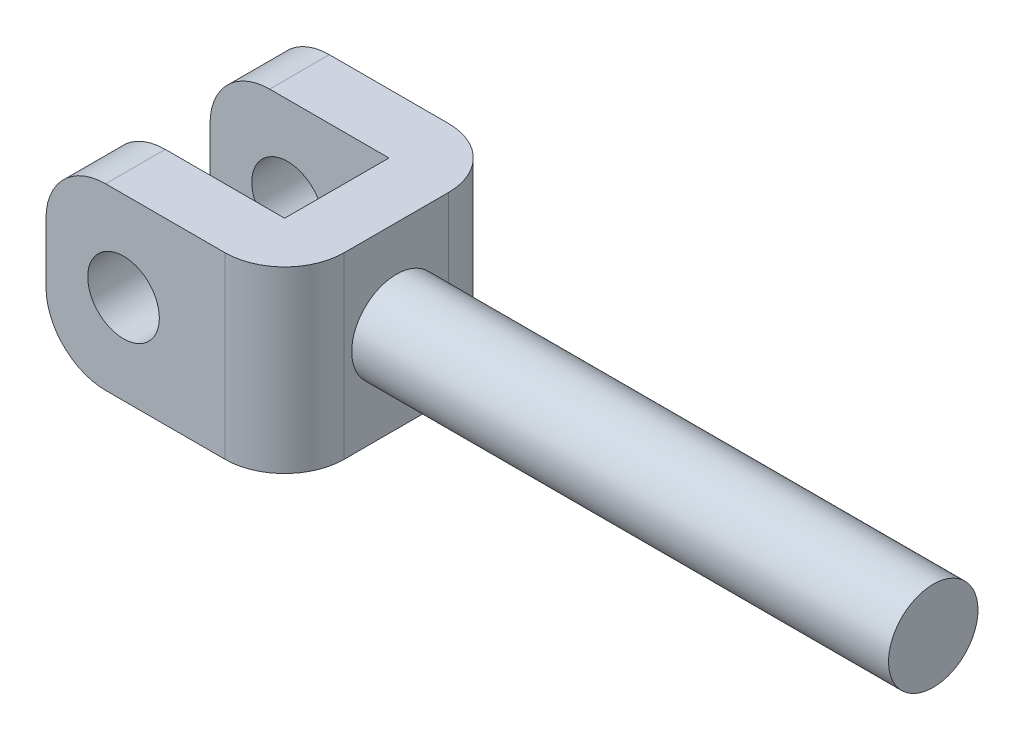
ISO-10303-21;
HEADER;
FILE_DESCRIPTION(('STEP AP214'),'2;1');
FILE_NAME('part.step','',(''),(''),'','','');
FILE_SCHEMA(('AUTOMOTIVE_DESIGN { 1 0 10303 214 1 1 1 1 }'));
ENDSEC;
DATA;
#1=APPLICATION_CONTEXT('core data for automotive mechanical design processes');
#2=APPLICATION_PROTOCOL_DEFINITION('international standard','automotive_design',2000,#1);
#3=PRODUCT_CONTEXT('',#1,'mechanical');
#4=PRODUCT('Part','Part','',(#3));
#5=PRODUCT_RELATED_PRODUCT_CATEGORY('part','',(#4));
#6=PRODUCT_DEFINITION_FORMATION('','',#4);
#7=PRODUCT_DEFINITION_CONTEXT('part definition',#1,'design');
#8=PRODUCT_DEFINITION('design','',#6,#7);
#9=PRODUCT_DEFINITION_SHAPE('','',#8);
#10=(LENGTH_UNIT() NAMED_UNIT(*) SI_UNIT(.MILLI.,.METRE.));
#11=(NAMED_UNIT(*) PLANE_ANGLE_UNIT() SI_UNIT($,.RADIAN.));
#12=(NAMED_UNIT(*) SI_UNIT($,.STERADIAN.) SOLID_ANGLE_UNIT());
#13=UNCERTAINTY_MEASURE_WITH_UNIT(LENGTH_MEASURE(1.E-05),#10,'distance_accuracy_value','');
#14=(GEOMETRIC_REPRESENTATION_CONTEXT(3) GLOBAL_UNCERTAINTY_ASSIGNED_CONTEXT((#13)) GLOBAL_UNIT_ASSIGNED_CONTEXT((#10,
#11,#12)) REPRESENTATION_CONTEXT('',''));
#15=CARTESIAN_POINT('',(0.,0.,0.));
#16=DIRECTION('',(0.,0.,1.));
#17=DIRECTION('',(1.,0.,0.));
#18=AXIS2_PLACEMENT_3D('',#15,#16,#17);
#19=CARTESIAN_POINT('',(10.,0.,0.));
#20=DIRECTION('',(-1.,0.,0.));
#21=DIRECTION('',(0.,0.,1.));
#22=AXIS2_PLACEMENT_3D('',#19,#20,#21);
#23=CYLINDRICAL_SURFACE('',#22,0.75);
#24=CARTESIAN_POINT('',(0.999999999999999,0.,0.));
#25=DIRECTION('',(1.,0.,0.));
#26=DIRECTION('',(0.,0.,-1.));
#27=AXIS2_PLACEMENT_3D('',#24,#25,#26);
#28=CIRCLE('',#27,0.75);
#29=CARTESIAN_POINT('',(0.999999999999999,0.,-0.75));
#30=VERTEX_POINT('',#29);
#31=EDGE_CURVE('E217',#30,#30,#28,.T.);
#32=ORIENTED_EDGE('',*,*,#31,.T.);
#33=EDGE_LOOP('',(#32));
#34=FACE_BOUND('',#33,.T.);
#35=CARTESIAN_POINT('',(10.,0.,0.));
#36=DIRECTION('',(1.,0.,0.));
#37=DIRECTION('',(0.,0.,-1.));
#38=AXIS2_PLACEMENT_3D('',#35,#36,#37);
#39=CIRCLE('',#38,0.75);
#40=CARTESIAN_POINT('',(10.,0.,-0.75));
#41=VERTEX_POINT('',#40);
#42=EDGE_CURVE('E230',#41,#41,#39,.T.);
#43=ORIENTED_EDGE('',*,*,#42,.F.);
#44=EDGE_LOOP('',(#43));
#45=FACE_BOUND('',#44,.T.);
#46=ADVANCED_FACE('F43',(#34,#45),#23,.T.);
#47=CARTESIAN_POINT('',(10.,0.,0.));
#48=DIRECTION('',(1.,0.,0.));
#49=DIRECTION('',(0.,0.,-1.));
#50=AXIS2_PLACEMENT_3D('',#47,#48,#49);
#51=PLANE('',#50);
#52=ORIENTED_EDGE('',*,*,#42,.T.);
#53=EDGE_LOOP('',(#52));
#54=FACE_BOUND('',#53,.T.);
#55=ADVANCED_FACE('F346',(#54),#51,.T.);
#56=CARTESIAN_POINT('',(0.,-1.5,-0.875));
#57=DIRECTION('',(0.,0.,1.));
#58=DIRECTION('',(1.,0.,0.));
#59=AXIS2_PLACEMENT_3D('',#56,#57,#58);
#60=PLANE('',#59);
#61=CARTESIAN_POINT('',(-1.7,0.,-0.875));
#62=DIRECTION('',(0.,0.,1.));
#63=DIRECTION('',(1.,0.,0.));
#64=AXIS2_PLACEMENT_3D('',#61,#62,#63);
#65=CIRCLE('',#64,0.6);
#66=CARTESIAN_POINT('',(-1.1,0.,-0.875));
#67=VERTEX_POINT('',#66);
#68=EDGE_CURVE('E161',#67,#67,#65,.T.);
#69=ORIENTED_EDGE('',*,*,#68,.F.);
#70=EDGE_LOOP('',(#69));
#71=FACE_BOUND('',#70,.T.);
#72=DIRECTION('',(1.,0.,0.));
#73=VECTOR('',#72,1.);
#74=CARTESIAN_POINT('',(0.,1.5,-0.875));
#75=LINE('',#74,#73);
#76=CARTESIAN_POINT('',(-2.,1.5,-0.875));
#77=VERTEX_POINT('',#76);
#78=CARTESIAN_POINT('',(0.,1.5,-0.875));
#79=VERTEX_POINT('',#78);
#80=EDGE_CURVE('E149',#77,#79,#75,.T.);
#81=ORIENTED_EDGE('',*,*,#80,.F.);
#82=CARTESIAN_POINT('',(-2.,0.5,-0.875));
#83=DIRECTION('',(0.,0.,1.));
#84=DIRECTION('',(1.,0.,0.));
#85=AXIS2_PLACEMENT_3D('',#82,#83,#84);
#86=CIRCLE('',#85,1.);
#87=CARTESIAN_POINT('',(-3.,0.5,-0.875));
#88=VERTEX_POINT('',#87);
#89=EDGE_CURVE('E252',#77,#88,#86,.T.);
#90=ORIENTED_EDGE('',*,*,#89,.T.);
#91=DIRECTION('',(0.,1.,0.));
#92=VECTOR('',#91,1.);
#93=CARTESIAN_POINT('',(-3.,-1.5,-0.875));
#94=LINE('',#93,#92);
#95=CARTESIAN_POINT('',(-3.,-0.5,-0.875));
#96=VERTEX_POINT('',#95);
#97=EDGE_CURVE('E213',#96,#88,#94,.T.);
#98=ORIENTED_EDGE('',*,*,#97,.F.);
#99=CARTESIAN_POINT('',(-2.,-0.5,-0.875));
#100=DIRECTION('',(0.,0.,1.));
#101=DIRECTION('',(1.,0.,0.));
#102=AXIS2_PLACEMENT_3D('',#99,#100,#101);
#103=CIRCLE('',#102,1.);
#104=CARTESIAN_POINT('',(-2.,-1.5,-0.875));
#105=VERTEX_POINT('',#104);
#106=EDGE_CURVE('E249',#96,#105,#103,.T.);
#107=ORIENTED_EDGE('',*,*,#106,.T.);
#108=DIRECTION('',(1.,0.,0.));
#109=VECTOR('',#108,1.);
#110=CARTESIAN_POINT('',(0.,-1.5,-0.875));
#111=LINE('',#110,#109);
#112=CARTESIAN_POINT('',(0.,-1.5,-0.875));
#113=VERTEX_POINT('',#112);
#114=EDGE_CURVE('E167',#105,#113,#111,.T.);
#115=ORIENTED_EDGE('',*,*,#114,.T.);
#116=DIRECTION('',(0.,1.,0.));
#117=VECTOR('',#116,1.);
#118=CARTESIAN_POINT('',(0.,-1.5,-0.875));
#119=LINE('',#118,#117);
#120=EDGE_CURVE('E164',#113,#79,#119,.T.);
#121=ORIENTED_EDGE('',*,*,#120,.T.);
#122=EDGE_LOOP('',(#81,#90,#98,#107,#115,#121));
#123=FACE_BOUND('',#122,.T.);
#124=ADVANCED_FACE('F165',(#71,#123),#60,.T.);
#125=CARTESIAN_POINT('',(-3.,-1.5,-1.875));
#126=DIRECTION('',(-1.,0.,0.));
#127=DIRECTION('',(0.,0.,1.));
#128=AXIS2_PLACEMENT_3D('',#125,#126,#127);
#129=PLANE('',#128);
#130=ORIENTED_EDGE('',*,*,#97,.T.);
#131=DIRECTION('',(0.,0.,1.));
#132=VECTOR('',#131,1.);
#133=CARTESIAN_POINT('',(-3.,0.5,-1.875));
#134=LINE('',#133,#132);
#135=CARTESIAN_POINT('',(-3.,0.5,-1.875));
#136=VERTEX_POINT('',#135);
#137=EDGE_CURVE('E259',#88,#136,#134,.F.);
#138=ORIENTED_EDGE('',*,*,#137,.T.);
#139=DIRECTION('',(0.,1.,0.));
#140=VECTOR('',#139,1.);
#141=CARTESIAN_POINT('',(-3.,-1.5,-1.875));
#142=LINE('',#141,#140);
#143=CARTESIAN_POINT('',(-3.,-0.5,-1.875));
#144=VERTEX_POINT('',#143);
#145=EDGE_CURVE('E218',#144,#136,#142,.T.);
#146=ORIENTED_EDGE('',*,*,#145,.F.);
#147=DIRECTION('',(0.,0.,1.));
#148=VECTOR('',#147,1.);
#149=CARTESIAN_POINT('',(-3.,-0.5,-0.875));
#150=LINE('',#149,#148);
#151=EDGE_CURVE('E255',#144,#96,#150,.T.);
#152=ORIENTED_EDGE('',*,*,#151,.T.);
#153=EDGE_LOOP('',(#130,#138,#146,#152));
#154=FACE_BOUND('',#153,.T.);
#155=ADVANCED_FACE('F384',(#154),#129,.T.);
#156=CARTESIAN_POINT('',(1.,-1.5,-1.875));
#157=DIRECTION('',(0.,0.,-1.));
#158=DIRECTION('',(-1.,0.,0.));
#159=AXIS2_PLACEMENT_3D('',#156,#157,#158);
#160=PLANE('',#159);
#161=CARTESIAN_POINT('',(-1.7,0.,-1.875));
#162=DIRECTION('',(0.,0.,-1.));
#163=DIRECTION('',(-1.,0.,0.));
#164=AXIS2_PLACEMENT_3D('',#161,#162,#163);
#165=CIRCLE('',#164,0.6);
#166=CARTESIAN_POINT('',(-2.3,0.,-1.875));
#167=VERTEX_POINT('',#166);
#168=EDGE_CURVE('E416',#167,#167,#165,.T.);
#169=ORIENTED_EDGE('',*,*,#168,.F.);
#170=EDGE_LOOP('',(#169));
#171=FACE_BOUND('',#170,.T.);
#172=ORIENTED_EDGE('',*,*,#145,.T.);
#173=CARTESIAN_POINT('',(-2.,0.5,-1.875));
#174=DIRECTION('',(0.,0.,-1.));
#175=DIRECTION('',(-1.,0.,0.));
#176=AXIS2_PLACEMENT_3D('',#173,#174,#175);
#177=CIRCLE('',#176,1.);
#178=CARTESIAN_POINT('',(-2.,1.5,-1.875));
#179=VERTEX_POINT('',#178);
#180=EDGE_CURVE('E268',#136,#179,#177,.T.);
#181=ORIENTED_EDGE('',*,*,#180,.T.);
#182=DIRECTION('',(-1.,0.,0.));
#183=VECTOR('',#182,1.);
#184=CARTESIAN_POINT('',(1.,1.5,-1.875));
#185=LINE('',#184,#183);
#186=CARTESIAN_POINT('',(0.,1.5,-1.875));
#187=VERTEX_POINT('',#186);
#188=EDGE_CURVE('E191',#187,#179,#185,.T.);
#189=ORIENTED_EDGE('',*,*,#188,.F.);
#190=DIRECTION('',(0.,1.,0.));
#191=VECTOR('',#190,1.);
#192=CARTESIAN_POINT('',(0.,-1.5,-1.875));
#193=LINE('',#192,#191);
#194=CARTESIAN_POINT('',(0.,-1.5,-1.875));
#195=VERTEX_POINT('',#194);
#196=EDGE_CURVE('E262',#187,#195,#193,.F.);
#197=ORIENTED_EDGE('',*,*,#196,.T.);
#198=DIRECTION('',(-1.,0.,0.));
#199=VECTOR('',#198,1.);
#200=CARTESIAN_POINT('',(1.,-1.5,-1.875));
#201=LINE('',#200,#199);
#202=CARTESIAN_POINT('',(-2.,-1.5,-1.875));
#203=VERTEX_POINT('',#202);
#204=EDGE_CURVE('E173',#195,#203,#201,.T.);
#205=ORIENTED_EDGE('',*,*,#204,.T.);
#206=CARTESIAN_POINT('',(-2.,-0.5,-1.875));
#207=DIRECTION('',(0.,0.,-1.));
#208=DIRECTION('',(-1.,0.,0.));
#209=AXIS2_PLACEMENT_3D('',#206,#207,#208);
#210=CIRCLE('',#209,1.);
#211=EDGE_CURVE('E265',#203,#144,#210,.T.);
#212=ORIENTED_EDGE('',*,*,#211,.T.);
#213=EDGE_LOOP('',(#172,#181,#189,#197,#205,#212));
#214=FACE_BOUND('',#213,.T.);
#215=ADVANCED_FACE('F378',(#171,#214),#160,.T.);
#216=CARTESIAN_POINT('',(1.,-1.5,-1.875));
#217=DIRECTION('',(1.,0.,0.));
#218=DIRECTION('',(0.,0.,-1.));
#219=AXIS2_PLACEMENT_3D('',#216,#217,#218);
#220=PLANE('',#219);
#221=ORIENTED_EDGE('',*,*,#31,.F.);
#222=EDGE_LOOP('',(#221));
#223=FACE_BOUND('',#222,.T.);
#224=DIRECTION('',(0.,0.,-1.));
#225=VECTOR('',#224,1.);
#226=CARTESIAN_POINT('',(1.,-1.5,-1.875));
#227=LINE('',#226,#225);
#228=CARTESIAN_POINT('',(1.,-1.5,0.874999999999999));
#229=VERTEX_POINT('',#228);
#230=CARTESIAN_POINT('',(1.,-1.5,-0.875000000000001));
#231=VERTEX_POINT('',#230);
#232=EDGE_CURVE('E206',#229,#231,#227,.T.);
#233=ORIENTED_EDGE('',*,*,#232,.T.);
#234=DIRECTION('',(0.,1.,0.));
#235=VECTOR('',#234,1.);
#236=CARTESIAN_POINT('',(1.,-1.5,-0.875));
#237=LINE('',#236,#235);
#238=CARTESIAN_POINT('',(1.,1.5,-0.875000000000001));
#239=VERTEX_POINT('',#238);
#240=EDGE_CURVE('E11',#231,#239,#237,.T.);
#241=ORIENTED_EDGE('',*,*,#240,.T.);
#242=DIRECTION('',(0.,0.,-1.));
#243=VECTOR('',#242,1.);
#244=CARTESIAN_POINT('',(1.,1.5,-1.875));
#245=LINE('',#244,#243);
#246=CARTESIAN_POINT('',(1.,1.5,0.874999999999999));
#247=VERTEX_POINT('',#246);
#248=EDGE_CURVE('E187',#247,#239,#245,.T.);
#249=ORIENTED_EDGE('',*,*,#248,.F.);
#250=DIRECTION('',(0.,1.,0.));
#251=VECTOR('',#250,1.);
#252=CARTESIAN_POINT('',(1.,-1.5,0.875));
#253=LINE('',#252,#251);
#254=EDGE_CURVE('E53',#247,#229,#253,.F.);
#255=ORIENTED_EDGE('',*,*,#254,.T.);
#256=EDGE_LOOP('',(#233,#241,#249,#255));
#257=FACE_BOUND('',#256,.T.);
#258=ADVANCED_FACE('F309',(#223,#257),#220,.T.);
#259=CARTESIAN_POINT('',(1.,-1.5,1.875));
#260=DIRECTION('',(0.,0.,1.));
#261=DIRECTION('',(1.,0.,0.));
#262=AXIS2_PLACEMENT_3D('',#259,#260,#261);
#263=PLANE('',#262);
#264=CARTESIAN_POINT('',(-1.7,0.,1.875));
#265=DIRECTION('',(0.,0.,1.));
#266=DIRECTION('',(1.,0.,0.));
#267=AXIS2_PLACEMENT_3D('',#264,#265,#266);
#268=CIRCLE('',#267,0.6);
#269=CARTESIAN_POINT('',(-1.1,0.,1.875));
#270=VERTEX_POINT('',#269);
#271=EDGE_CURVE('E408',#270,#270,#268,.T.);
#272=ORIENTED_EDGE('',*,*,#271,.F.);
#273=EDGE_LOOP('',(#272));
#274=FACE_BOUND('',#273,.T.);
#275=DIRECTION('',(0.,1.,0.));
#276=VECTOR('',#275,1.);
#277=CARTESIAN_POINT('',(-3.,-1.5,1.875));
#278=LINE('',#277,#276);
#279=CARTESIAN_POINT('',(-3.,-0.5,1.875));
#280=VERTEX_POINT('',#279);
#281=CARTESIAN_POINT('',(-3.,0.5,1.875));
#282=VERTEX_POINT('',#281);
#283=EDGE_CURVE('E222',#280,#282,#278,.T.);
#284=ORIENTED_EDGE('',*,*,#283,.F.);
#285=CARTESIAN_POINT('',(-2.,-0.5,1.875));
#286=DIRECTION('',(0.,0.,1.));
#287=DIRECTION('',(1.,0.,0.));
#288=AXIS2_PLACEMENT_3D('',#285,#286,#287);
#289=CIRCLE('',#288,1.);
#290=CARTESIAN_POINT('',(-2.,-1.5,1.875));
#291=VERTEX_POINT('',#290);
#292=EDGE_CURVE('E296',#280,#291,#289,.T.);
#293=ORIENTED_EDGE('',*,*,#292,.T.);
#294=DIRECTION('',(1.,0.,0.));
#295=VECTOR('',#294,1.);
#296=CARTESIAN_POINT('',(1.,-1.5,1.875));
#297=LINE('',#296,#295);
#298=CARTESIAN_POINT('',(0.,-1.5,1.875));
#299=VERTEX_POINT('',#298);
#300=EDGE_CURVE('E202',#291,#299,#297,.T.);
#301=ORIENTED_EDGE('',*,*,#300,.T.);
#302=DIRECTION('',(0.,1.,0.));
#303=VECTOR('',#302,1.);
#304=CARTESIAN_POINT('',(0.,-1.5,1.875));
#305=LINE('',#304,#303);
#306=CARTESIAN_POINT('',(0.,1.5,1.875));
#307=VERTEX_POINT('',#306);
#308=EDGE_CURVE('E289',#299,#307,#305,.T.);
#309=ORIENTED_EDGE('',*,*,#308,.T.);
#310=DIRECTION('',(1.,0.,0.));
#311=VECTOR('',#310,1.);
#312=CARTESIAN_POINT('',(1.,1.5,1.875));
#313=LINE('',#312,#311);
#314=CARTESIAN_POINT('',(-2.,1.5,1.875));
#315=VERTEX_POINT('',#314);
#316=EDGE_CURVE('E180',#315,#307,#313,.T.);
#317=ORIENTED_EDGE('',*,*,#316,.F.);
#318=CARTESIAN_POINT('',(-2.,0.5,1.875));
#319=DIRECTION('',(0.,0.,1.));
#320=DIRECTION('',(1.,0.,0.));
#321=AXIS2_PLACEMENT_3D('',#318,#319,#320);
#322=CIRCLE('',#321,1.);
#323=EDGE_CURVE('E293',#315,#282,#322,.T.);
#324=ORIENTED_EDGE('',*,*,#323,.T.);
#325=EDGE_LOOP('',(#284,#293,#301,#309,#317,#324));
#326=FACE_BOUND('',#325,.T.);
#327=ADVANCED_FACE('F322',(#274,#326),#263,.T.);
#328=CARTESIAN_POINT('',(-3.,-1.5,0.875));
#329=DIRECTION('',(-1.,0.,0.));
#330=DIRECTION('',(0.,0.,1.));
#331=AXIS2_PLACEMENT_3D('',#328,#329,#330);
#332=PLANE('',#331);
#333=DIRECTION('',(0.,1.,0.));
#334=VECTOR('',#333,1.);
#335=CARTESIAN_POINT('',(-3.,-1.5,0.875));
#336=LINE('',#335,#334);
#337=CARTESIAN_POINT('',(-3.,-0.5,0.875));
#338=VERTEX_POINT('',#337);
#339=CARTESIAN_POINT('',(-3.,0.5,0.875));
#340=VERTEX_POINT('',#339);
#341=EDGE_CURVE('E225',#338,#340,#336,.T.);
#342=ORIENTED_EDGE('',*,*,#341,.F.);
#343=DIRECTION('',(0.,0.,1.));
#344=VECTOR('',#343,1.);
#345=CARTESIAN_POINT('',(-3.,-0.5,1.875));
#346=LINE('',#345,#344);
#347=EDGE_CURVE('E285',#338,#280,#346,.T.);
#348=ORIENTED_EDGE('',*,*,#347,.T.);
#349=ORIENTED_EDGE('',*,*,#283,.T.);
#350=DIRECTION('',(0.,0.,1.));
#351=VECTOR('',#350,1.);
#352=CARTESIAN_POINT('',(-3.,0.5,0.875));
#353=LINE('',#352,#351);
#354=EDGE_CURVE('E60',#282,#340,#353,.F.);
#355=ORIENTED_EDGE('',*,*,#354,.T.);
#356=EDGE_LOOP('',(#342,#348,#349,#355));
#357=FACE_BOUND('',#356,.T.);
#358=ADVANCED_FACE('F327',(#357),#332,.T.);
#359=CARTESIAN_POINT('',(-3.,-1.5,0.875));
#360=DIRECTION('',(0.,0.,-1.));
#361=DIRECTION('',(-1.,0.,0.));
#362=AXIS2_PLACEMENT_3D('',#359,#360,#361);
#363=PLANE('',#362);
#364=CARTESIAN_POINT('',(-1.7,0.,0.875));
#365=DIRECTION('',(0.,0.,-1.));
#366=DIRECTION('',(-1.,0.,0.));
#367=AXIS2_PLACEMENT_3D('',#364,#365,#366);
#368=CIRCLE('',#367,0.6);
#369=CARTESIAN_POINT('',(-2.3,0.,0.875));
#370=VERTEX_POINT('',#369);
#371=EDGE_CURVE('E47',#370,#370,#368,.T.);
#372=ORIENTED_EDGE('',*,*,#371,.F.);
#373=EDGE_LOOP('',(#372));
#374=FACE_BOUND('',#373,.T.);
#375=DIRECTION('',(-1.,0.,0.));
#376=VECTOR('',#375,1.);
#377=CARTESIAN_POINT('',(-3.,-1.5,0.875));
#378=LINE('',#377,#376);
#379=CARTESIAN_POINT('',(0.,-1.5,0.875));
#380=VERTEX_POINT('',#379);
#381=CARTESIAN_POINT('',(-2.,-1.5,0.875));
#382=VERTEX_POINT('',#381);
#383=EDGE_CURVE('E199',#380,#382,#378,.T.);
#384=ORIENTED_EDGE('',*,*,#383,.T.);
#385=CARTESIAN_POINT('',(-2.,-0.5,0.875));
#386=DIRECTION('',(0.,0.,-1.));
#387=DIRECTION('',(-1.,0.,0.));
#388=AXIS2_PLACEMENT_3D('',#385,#386,#387);
#389=CIRCLE('',#388,1.);
#390=EDGE_CURVE('E67',#382,#338,#389,.T.);
#391=ORIENTED_EDGE('',*,*,#390,.T.);
#392=ORIENTED_EDGE('',*,*,#341,.T.);
#393=CARTESIAN_POINT('',(-2.,0.5,0.875));
#394=DIRECTION('',(0.,0.,-1.));
#395=DIRECTION('',(-1.,0.,0.));
#396=AXIS2_PLACEMENT_3D('',#393,#394,#395);
#397=CIRCLE('',#396,1.);
#398=CARTESIAN_POINT('',(-2.,1.5,0.875));
#399=VERTEX_POINT('',#398);
#400=EDGE_CURVE('E299',#340,#399,#397,.T.);
#401=ORIENTED_EDGE('',*,*,#400,.T.);
#402=DIRECTION('',(-1.,0.,0.));
#403=VECTOR('',#402,1.);
#404=CARTESIAN_POINT('',(-3.,1.5,0.875));
#405=LINE('',#404,#403);
#406=CARTESIAN_POINT('',(0.,1.5,0.875));
#407=VERTEX_POINT('',#406);
#408=EDGE_CURVE('E177',#407,#399,#405,.T.);
#409=ORIENTED_EDGE('',*,*,#408,.F.);
#410=DIRECTION('',(0.,1.,0.));
#411=VECTOR('',#410,1.);
#412=CARTESIAN_POINT('',(0.,-1.5,0.875));
#413=LINE('',#412,#411);
#414=EDGE_CURVE('E172',#380,#407,#413,.T.);
#415=ORIENTED_EDGE('',*,*,#414,.F.);
#416=EDGE_LOOP('',(#384,#391,#392,#401,#409,#415));
#417=FACE_BOUND('',#416,.T.);
#418=ADVANCED_FACE('F333',(#374,#417),#363,.T.);
#419=CARTESIAN_POINT('',(0.,-1.5,0.));
#420=DIRECTION('',(0.,1.,0.));
#421=DIRECTION('',(0.,0.,1.));
#422=AXIS2_PLACEMENT_3D('',#419,#420,#421);
#423=PLANE('',#422);
#424=ORIENTED_EDGE('',*,*,#114,.F.);
#425=DIRECTION('',(0.,0.,1.));
#426=VECTOR('',#425,1.);
#427=CARTESIAN_POINT('',(-2.,-1.5,-1.875));
#428=LINE('',#427,#426);
#429=EDGE_CURVE('E280',#105,#203,#428,.F.);
#430=ORIENTED_EDGE('',*,*,#429,.T.);
#431=ORIENTED_EDGE('',*,*,#204,.F.);
#432=CARTESIAN_POINT('',(0.,-1.5,-0.875));
#433=DIRECTION('',(0.,1.,0.));
#434=DIRECTION('',(0.,0.,1.));
#435=AXIS2_PLACEMENT_3D('',#432,#433,#434);
#436=CIRCLE('',#435,1.);
#437=EDGE_CURVE('E274',#195,#231,#436,.F.);
#438=ORIENTED_EDGE('',*,*,#437,.T.);
#439=ORIENTED_EDGE('',*,*,#232,.F.);
#440=CARTESIAN_POINT('',(0.,-1.5,0.875));
#441=DIRECTION('',(0.,1.,0.));
#442=DIRECTION('',(0.,0.,1.));
#443=AXIS2_PLACEMENT_3D('',#440,#441,#442);
#444=CIRCLE('',#443,1.);
#445=EDGE_CURVE('E271',#229,#299,#444,.F.);
#446=ORIENTED_EDGE('',*,*,#445,.T.);
#447=ORIENTED_EDGE('',*,*,#300,.F.);
#448=DIRECTION('',(0.,0.,1.));
#449=VECTOR('',#448,1.);
#450=CARTESIAN_POINT('',(-2.,-1.5,0.875));
#451=LINE('',#450,#449);
#452=EDGE_CURVE('E277',#291,#382,#451,.F.);
#453=ORIENTED_EDGE('',*,*,#452,.T.);
#454=ORIENTED_EDGE('',*,*,#383,.F.);
#455=DIRECTION('',(0.,0.,1.));
#456=VECTOR('',#455,1.);
#457=CARTESIAN_POINT('',(0.,-1.5,-0.875));
#458=LINE('',#457,#456);
#459=EDGE_CURVE('E196',#113,#380,#458,.T.);
#460=ORIENTED_EDGE('',*,*,#459,.F.);
#461=EDGE_LOOP('',(#424,#430,#431,#438,#439,#446,#447,#453,#454,#460));
#462=FACE_BOUND('',#461,.T.);
#463=ADVANCED_FACE('F314',(#462),#423,.F.);
#464=CARTESIAN_POINT('',(0.,1.5,0.));
#465=DIRECTION('',(0.,1.,0.));
#466=DIRECTION('',(0.,0.,1.));
#467=AXIS2_PLACEMENT_3D('',#464,#465,#466);
#468=PLANE('',#467);
#469=ORIENTED_EDGE('',*,*,#188,.T.);
#470=DIRECTION('',(0.,0.,1.));
#471=VECTOR('',#470,1.);
#472=CARTESIAN_POINT('',(-2.,1.5,0.));
#473=LINE('',#472,#471);
#474=EDGE_CURVE('E158',#179,#77,#473,.T.);
#475=ORIENTED_EDGE('',*,*,#474,.T.);
#476=ORIENTED_EDGE('',*,*,#80,.T.);
#477=DIRECTION('',(0.,0.,1.));
#478=VECTOR('',#477,1.);
#479=CARTESIAN_POINT('',(0.,1.5,-0.875));
#480=LINE('',#479,#478);
#481=EDGE_CURVE('E155',#79,#407,#480,.T.);
#482=ORIENTED_EDGE('',*,*,#481,.T.);
#483=ORIENTED_EDGE('',*,*,#408,.T.);
#484=DIRECTION('',(0.,0.,1.));
#485=VECTOR('',#484,1.);
#486=CARTESIAN_POINT('',(-2.,1.5,0.));
#487=LINE('',#486,#485);
#488=EDGE_CURVE('E243',#399,#315,#487,.T.);
#489=ORIENTED_EDGE('',*,*,#488,.T.);
#490=ORIENTED_EDGE('',*,*,#316,.T.);
#491=CARTESIAN_POINT('',(0.,1.5,0.875));
#492=DIRECTION('',(0.,1.,0.));
#493=DIRECTION('',(0.,0.,1.));
#494=AXIS2_PLACEMENT_3D('',#491,#492,#493);
#495=CIRCLE('',#494,1.);
#496=EDGE_CURVE('E234',#307,#247,#495,.T.);
#497=ORIENTED_EDGE('',*,*,#496,.T.);
#498=ORIENTED_EDGE('',*,*,#248,.T.);
#499=CARTESIAN_POINT('',(0.,1.5,-0.875));
#500=DIRECTION('',(0.,1.,0.));
#501=DIRECTION('',(0.,0.,1.));
#502=AXIS2_PLACEMENT_3D('',#499,#500,#501);
#503=CIRCLE('',#502,1.);
#504=EDGE_CURVE('E240',#239,#187,#503,.T.);
#505=ORIENTED_EDGE('',*,*,#504,.T.);
#506=EDGE_LOOP('',(#469,#475,#476,#482,#483,#489,#490,#497,#498,#505));
#507=FACE_BOUND('',#506,.T.);
#508=ADVANCED_FACE('F152',(#507),#468,.T.);
#509=CARTESIAN_POINT('',(0.,0.,0.));
#510=DIRECTION('',(1.,0.,0.));
#511=DIRECTION('',(0.,0.,-1.));
#512=AXIS2_PLACEMENT_3D('',#509,#510,#511);
#513=PLANE('',#512);
#514=ORIENTED_EDGE('',*,*,#414,.T.);
#515=ORIENTED_EDGE('',*,*,#481,.F.);
#516=ORIENTED_EDGE('',*,*,#120,.F.);
#517=ORIENTED_EDGE('',*,*,#459,.T.);
#518=EDGE_LOOP('',(#514,#515,#516,#517));
#519=FACE_BOUND('',#518,.T.);
#520=ADVANCED_FACE('F175',(#519),#513,.F.);
#521=CARTESIAN_POINT('',(-2.,0.5,0.));
#522=DIRECTION('',(0.,0.,1.));
#523=DIRECTION('',(1.,0.,0.));
#524=AXIS2_PLACEMENT_3D('',#521,#522,#523);
#525=CYLINDRICAL_SURFACE('',#524,1.);
#526=ORIENTED_EDGE('',*,*,#180,.F.);
#527=ORIENTED_EDGE('',*,*,#137,.F.);
#528=ORIENTED_EDGE('',*,*,#89,.F.);
#529=ORIENTED_EDGE('',*,*,#474,.F.);
#530=EDGE_LOOP('',(#526,#527,#528,#529));
#531=FACE_BOUND('',#530,.T.);
#532=ADVANCED_FACE('F357',(#531),#525,.T.);
#533=CARTESIAN_POINT('',(-2.,-0.5,-1.875));
#534=DIRECTION('',(0.,0.,-1.));
#535=DIRECTION('',(-1.,0.,0.));
#536=AXIS2_PLACEMENT_3D('',#533,#534,#535);
#537=CYLINDRICAL_SURFACE('',#536,1.);
#538=ORIENTED_EDGE('',*,*,#211,.F.);
#539=ORIENTED_EDGE('',*,*,#429,.F.);
#540=ORIENTED_EDGE('',*,*,#106,.F.);
#541=ORIENTED_EDGE('',*,*,#151,.F.);
#542=EDGE_LOOP('',(#538,#539,#540,#541));
#543=FACE_BOUND('',#542,.T.);
#544=ADVANCED_FACE('F360',(#543),#537,.T.);
#545=CARTESIAN_POINT('',(-2.,-0.5,0.875));
#546=DIRECTION('',(0.,0.,-1.));
#547=DIRECTION('',(-1.,0.,0.));
#548=AXIS2_PLACEMENT_3D('',#545,#546,#547);
#549=CYLINDRICAL_SURFACE('',#548,1.);
#550=ORIENTED_EDGE('',*,*,#390,.F.);
#551=ORIENTED_EDGE('',*,*,#452,.F.);
#552=ORIENTED_EDGE('',*,*,#292,.F.);
#553=ORIENTED_EDGE('',*,*,#347,.F.);
#554=EDGE_LOOP('',(#550,#551,#552,#553));
#555=FACE_BOUND('',#554,.T.);
#556=ADVANCED_FACE('F330',(#555),#549,.T.);
#557=CARTESIAN_POINT('',(-2.,0.5,0.));
#558=DIRECTION('',(0.,0.,1.));
#559=DIRECTION('',(1.,0.,0.));
#560=AXIS2_PLACEMENT_3D('',#557,#558,#559);
#561=CYLINDRICAL_SURFACE('',#560,1.);
#562=ORIENTED_EDGE('',*,*,#400,.F.);
#563=ORIENTED_EDGE('',*,*,#354,.F.);
#564=ORIENTED_EDGE('',*,*,#323,.F.);
#565=ORIENTED_EDGE('',*,*,#488,.F.);
#566=EDGE_LOOP('',(#562,#563,#564,#565));
#567=FACE_BOUND('',#566,.T.);
#568=ADVANCED_FACE('F326',(#567),#561,.T.);
#569=CARTESIAN_POINT('',(0.,-1.5,-0.875));
#570=DIRECTION('',(0.,1.,0.));
#571=DIRECTION('',(0.,0.,1.));
#572=AXIS2_PLACEMENT_3D('',#569,#570,#571);
#573=CYLINDRICAL_SURFACE('',#572,1.);
#574=ORIENTED_EDGE('',*,*,#437,.F.);
#575=ORIENTED_EDGE('',*,*,#196,.F.);
#576=ORIENTED_EDGE('',*,*,#504,.F.);
#577=ORIENTED_EDGE('',*,*,#240,.F.);
#578=EDGE_LOOP('',(#574,#575,#576,#577));
#579=FACE_BOUND('',#578,.T.);
#580=ADVANCED_FACE('F368',(#579),#573,.T.);
#581=CARTESIAN_POINT('',(0.,-1.5,0.875));
#582=DIRECTION('',(0.,1.,0.));
#583=DIRECTION('',(0.,0.,1.));
#584=AXIS2_PLACEMENT_3D('',#581,#582,#583);
#585=CYLINDRICAL_SURFACE('',#584,1.);
#586=ORIENTED_EDGE('',*,*,#445,.F.);
#587=ORIENTED_EDGE('',*,*,#254,.F.);
#588=ORIENTED_EDGE('',*,*,#496,.F.);
#589=ORIENTED_EDGE('',*,*,#308,.F.);
#590=EDGE_LOOP('',(#586,#587,#588,#589));
#591=FACE_BOUND('',#590,.T.);
#592=ADVANCED_FACE('F45',(#591),#585,.T.);
#593=CARTESIAN_POINT('',(-1.7,0.,3.125));
#594=DIRECTION('',(0.,0.,-1.));
#595=DIRECTION('',(-1.,0.,0.));
#596=AXIS2_PLACEMENT_3D('',#593,#594,#595);
#597=CYLINDRICAL_SURFACE('',#596,0.6);
#598=ORIENTED_EDGE('',*,*,#271,.T.);
#599=EDGE_LOOP('',(#598));
#600=FACE_BOUND('',#599,.T.);
#601=ORIENTED_EDGE('',*,*,#371,.T.);
#602=EDGE_LOOP('',(#601));
#603=FACE_BOUND('',#602,.T.);
#604=ADVANCED_FACE('F374',(#600,#603),#597,.F.);
#605=ORIENTED_EDGE('',*,*,#68,.T.);
#606=EDGE_LOOP('',(#605));
#607=FACE_BOUND('',#606,.T.);
#608=ORIENTED_EDGE('',*,*,#168,.T.);
#609=EDGE_LOOP('',(#608));
#610=FACE_BOUND('',#609,.T.);
#611=ADVANCED_FACE('F422',(#607,#610),#597,.F.);
#612=CLOSED_SHELL('',(#46,#55,#124,#155,#215,#258,#327,#358,#418,#463,#508,#520,#532,#544,#556,
#568,#580,#592,#604,#611));
#613=MANIFOLD_SOLID_BREP('B2',#612);
#614=ADVANCED_BREP_SHAPE_REPRESENTATION('',(#18,#613),#14);
#615=SHAPE_DEFINITION_REPRESENTATION(#9,#614);
ENDSEC;
END-ISO-10303-21;
